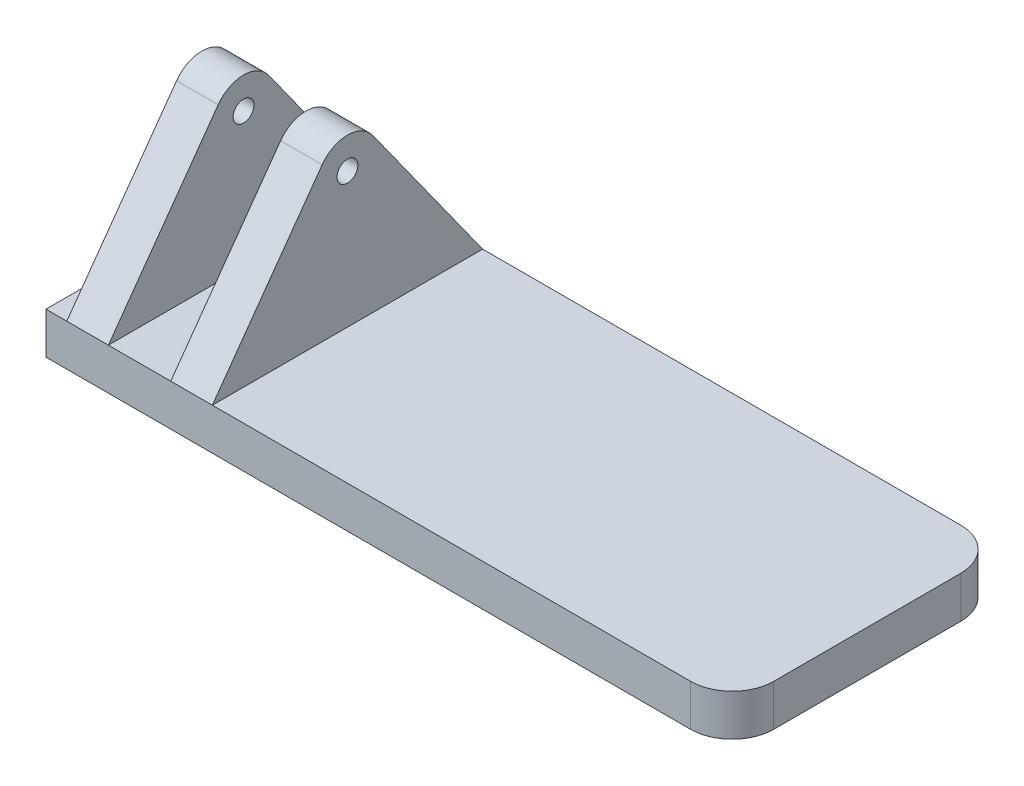
ISO-10303-21;
HEADER;
FILE_DESCRIPTION(('STEP AP214'),'2;1');
FILE_NAME('part.step','',(''),(''),'','','');
FILE_SCHEMA(('AUTOMOTIVE_DESIGN { 1 0 10303 214 1 1 1 1 }'));
ENDSEC;
DATA;
#1=APPLICATION_CONTEXT('core data for automotive mechanical design processes');
#2=APPLICATION_PROTOCOL_DEFINITION('international standard','automotive_design',2000,#1);
#3=PRODUCT_CONTEXT('',#1,'mechanical');
#4=PRODUCT('Part','Part','',(#3));
#5=PRODUCT_RELATED_PRODUCT_CATEGORY('part','',(#4));
#6=PRODUCT_DEFINITION_FORMATION('','',#4);
#7=PRODUCT_DEFINITION_CONTEXT('part definition',#1,'design');
#8=PRODUCT_DEFINITION('design','',#6,#7);
#9=PRODUCT_DEFINITION_SHAPE('','',#8);
#10=(LENGTH_UNIT() NAMED_UNIT(*) SI_UNIT(.MILLI.,.METRE.));
#11=(NAMED_UNIT(*) PLANE_ANGLE_UNIT() SI_UNIT($,.RADIAN.));
#12=(NAMED_UNIT(*) SI_UNIT($,.STERADIAN.) SOLID_ANGLE_UNIT());
#13=UNCERTAINTY_MEASURE_WITH_UNIT(LENGTH_MEASURE(1.E-05),#10,'distance_accuracy_value','');
#14=(GEOMETRIC_REPRESENTATION_CONTEXT(3) GLOBAL_UNCERTAINTY_ASSIGNED_CONTEXT((#13)) GLOBAL_UNIT_ASSIGNED_CONTEXT((#10,
#11,#12)) REPRESENTATION_CONTEXT('',''));
#15=CARTESIAN_POINT('',(0.,0.,0.));
#16=DIRECTION('',(0.,0.,1.));
#17=DIRECTION('',(1.,0.,0.));
#18=AXIS2_PLACEMENT_3D('',#15,#16,#17);
#19=CARTESIAN_POINT('',(49.2125,15.875,-3.175));
#20=DIRECTION('',(0.,-1.,0.));
#21=DIRECTION('',(0.,0.,-1.));
#22=AXIS2_PLACEMENT_3D('',#19,#20,#21);
#23=CYLINDRICAL_SURFACE('',#22,3.175);
#24=CARTESIAN_POINT('',(49.2125,3.175,-3.175));
#25=DIRECTION('',(0.,1.,0.));
#26=DIRECTION('',(-1.,0.,0.));
#27=AXIS2_PLACEMENT_3D('',#24,#25,#26);
#28=CIRCLE('',#27,3.175);
#29=CARTESIAN_POINT('',(49.2125,3.175,0.));
#30=VERTEX_POINT('',#29);
#31=CARTESIAN_POINT('',(52.3875,3.175,-3.175));
#32=VERTEX_POINT('',#31);
#33=EDGE_CURVE('E173',#30,#32,#28,.T.);
#34=ORIENTED_EDGE('',*,*,#33,.F.);
#35=DIRECTION('',(0.,-1.,0.));
#36=VECTOR('',#35,1.);
#37=CARTESIAN_POINT('',(49.2125,15.875,0.));
#38=LINE('',#37,#36);
#39=CARTESIAN_POINT('',(49.2125,0.,0.));
#40=VERTEX_POINT('',#39);
#41=EDGE_CURVE('E183',#30,#40,#38,.T.);
#42=ORIENTED_EDGE('',*,*,#41,.T.);
#43=CARTESIAN_POINT('',(49.2125,0.,-3.175));
#44=DIRECTION('',(0.,1.,0.));
#45=DIRECTION('',(0.,0.,-1.));
#46=AXIS2_PLACEMENT_3D('',#43,#44,#45);
#47=CIRCLE('',#46,3.175);
#48=CARTESIAN_POINT('',(52.3875,0.,-3.175));
#49=VERTEX_POINT('',#48);
#50=EDGE_CURVE('E169',#40,#49,#47,.T.);
#51=ORIENTED_EDGE('',*,*,#50,.T.);
#52=DIRECTION('',(0.,-1.,0.));
#53=VECTOR('',#52,1.);
#54=CARTESIAN_POINT('',(52.3875,15.875,-3.175));
#55=LINE('',#54,#53);
#56=EDGE_CURVE('E178',#32,#49,#55,.T.);
#57=ORIENTED_EDGE('',*,*,#56,.F.);
#58=EDGE_LOOP('',(#34,#42,#51,#57));
#59=FACE_BOUND('',#58,.T.);
#60=ADVANCED_FACE('F32',(#59),#23,.T.);
#61=CARTESIAN_POINT('',(49.2125,15.875,-17.4625));
#62=DIRECTION('',(0.,-1.,0.));
#63=DIRECTION('',(0.,0.,-1.));
#64=AXIS2_PLACEMENT_3D('',#61,#62,#63);
#65=CYLINDRICAL_SURFACE('',#64,3.175);
#66=CARTESIAN_POINT('',(49.2125,3.175,-17.4625));
#67=DIRECTION('',(0.,1.,0.));
#68=DIRECTION('',(-1.,0.,0.));
#69=AXIS2_PLACEMENT_3D('',#66,#67,#68);
#70=CIRCLE('',#69,3.175);
#71=CARTESIAN_POINT('',(52.3875,3.175,-17.4625));
#72=VERTEX_POINT('',#71);
#73=CARTESIAN_POINT('',(49.2125,3.175,-20.6375));
#74=VERTEX_POINT('',#73);
#75=EDGE_CURVE('E177',#72,#74,#70,.T.);
#76=ORIENTED_EDGE('',*,*,#75,.F.);
#77=DIRECTION('',(0.,-1.,0.));
#78=VECTOR('',#77,1.);
#79=CARTESIAN_POINT('',(52.3875,15.875,-17.4625));
#80=LINE('',#79,#78);
#81=CARTESIAN_POINT('',(52.3875,0.,-17.4625));
#82=VERTEX_POINT('',#81);
#83=EDGE_CURVE('E186',#72,#82,#80,.T.);
#84=ORIENTED_EDGE('',*,*,#83,.T.);
#85=CARTESIAN_POINT('',(49.2125,0.,-17.4625));
#86=DIRECTION('',(0.,1.,0.));
#87=DIRECTION('',(0.,0.,-1.));
#88=AXIS2_PLACEMENT_3D('',#85,#86,#87);
#89=CIRCLE('',#88,3.175);
#90=CARTESIAN_POINT('',(49.2125,0.,-20.6375));
#91=VERTEX_POINT('',#90);
#92=EDGE_CURVE('E172',#82,#91,#89,.T.);
#93=ORIENTED_EDGE('',*,*,#92,.T.);
#94=DIRECTION('',(0.,-1.,0.));
#95=VECTOR('',#94,1.);
#96=CARTESIAN_POINT('',(49.2125,15.875,-20.6375));
#97=LINE('',#96,#95);
#98=EDGE_CURVE('E181',#74,#91,#97,.T.);
#99=ORIENTED_EDGE('',*,*,#98,.F.);
#100=EDGE_LOOP('',(#76,#84,#93,#99));
#101=FACE_BOUND('',#100,.T.);
#102=ADVANCED_FACE('F304',(#101),#65,.T.);
#103=CARTESIAN_POINT('',(4.7625,3.175,-20.6375));
#104=DIRECTION('',(0.,1.,0.));
#105=DIRECTION('',(0.,0.,1.));
#106=AXIS2_PLACEMENT_3D('',#103,#104,#105);
#107=PLANE('',#106);
#108=DIRECTION('',(-1.,0.,0.));
#109=VECTOR('',#108,1.);
#110=CARTESIAN_POINT('',(4.7625,3.175,0.));
#111=LINE('',#110,#109);
#112=CARTESIAN_POINT('',(9.52500000000001,3.175,0.));
#113=VERTEX_POINT('',#112);
#114=CARTESIAN_POINT('',(4.7625,3.175,0.));
#115=VERTEX_POINT('',#114);
#116=EDGE_CURVE('E129',#113,#115,#111,.T.);
#117=ORIENTED_EDGE('',*,*,#116,.F.);
#118=DIRECTION('',(0.,0.,1.));
#119=VECTOR('',#118,1.);
#120=CARTESIAN_POINT('',(9.525,3.175,-20.6375));
#121=LINE('',#120,#119);
#122=CARTESIAN_POINT('',(9.525,3.175,-20.6375));
#123=VERTEX_POINT('',#122);
#124=EDGE_CURVE('E36',#123,#113,#121,.T.);
#125=ORIENTED_EDGE('',*,*,#124,.F.);
#126=DIRECTION('',(-1.,0.,0.));
#127=VECTOR('',#126,1.);
#128=CARTESIAN_POINT('',(4.7625,3.175,-20.6375));
#129=LINE('',#128,#127);
#130=CARTESIAN_POINT('',(4.7625,3.175,-20.6375));
#131=VERTEX_POINT('',#130);
#132=EDGE_CURVE('E132',#123,#131,#129,.T.);
#133=ORIENTED_EDGE('',*,*,#132,.T.);
#134=DIRECTION('',(0.,0.,1.));
#135=VECTOR('',#134,1.);
#136=CARTESIAN_POINT('',(4.7625,3.175,-20.6375));
#137=LINE('',#136,#135);
#138=EDGE_CURVE('E114',#131,#115,#137,.T.);
#139=ORIENTED_EDGE('',*,*,#138,.T.);
#140=EDGE_LOOP('',(#117,#125,#133,#139));
#141=FACE_BOUND('',#140,.T.);
#142=ADVANCED_FACE('F266',(#141),#107,.T.);
#143=CARTESIAN_POINT('',(52.3875,13.49375,-10.31875));
#144=DIRECTION('',(-1.,0.,0.));
#145=DIRECTION('',(0.,0.,1.));
#146=AXIS2_PLACEMENT_3D('',#143,#144,#145);
#147=CYLINDRICAL_SURFACE('',#146,2.38125);
#148=DIRECTION('',(-1.,0.,0.));
#149=VECTOR('',#148,1.);
#150=CARTESIAN_POINT('',(52.3875,14.8802197291081,-12.2547389598773));
#151=LINE('',#150,#149);
#152=CARTESIAN_POINT('',(12.7,14.8802197291081,-12.2547389598773));
#153=VERTEX_POINT('',#152);
#154=CARTESIAN_POINT('',(9.525,14.8802197291081,-12.2547389598773));
#155=VERTEX_POINT('',#154);
#156=EDGE_CURVE('E117',#153,#155,#151,.T.);
#157=ORIENTED_EDGE('',*,*,#156,.T.);
#158=CARTESIAN_POINT('',(9.525,13.49375,-10.31875));
#159=DIRECTION('',(-1.,0.,0.));
#160=DIRECTION('',(0.,0.,1.));
#161=AXIS2_PLACEMENT_3D('',#158,#159,#160);
#162=CIRCLE('',#161,2.38125);
#163=CARTESIAN_POINT('',(9.525,14.8802197291081,-8.38276104012266));
#164=VERTEX_POINT('',#163);
#165=EDGE_CURVE('E51',#155,#164,#162,.F.);
#166=ORIENTED_EDGE('',*,*,#165,.T.);
#167=DIRECTION('',(-1.,0.,0.));
#168=VECTOR('',#167,1.);
#169=CARTESIAN_POINT('',(52.3875,14.8802197291081,-8.38276104012266));
#170=LINE('',#169,#168);
#171=CARTESIAN_POINT('',(12.7,14.8802197291081,-8.38276104012266));
#172=VERTEX_POINT('',#171);
#173=EDGE_CURVE('E42',#172,#164,#170,.T.);
#174=ORIENTED_EDGE('',*,*,#173,.F.);
#175=CARTESIAN_POINT('',(12.7,13.49375,-10.31875));
#176=DIRECTION('',(1.,0.,0.));
#177=DIRECTION('',(0.,1.,0.));
#178=AXIS2_PLACEMENT_3D('',#175,#176,#177);
#179=CIRCLE('',#178,2.38125);
#180=EDGE_CURVE('E209',#172,#153,#179,.F.);
#181=ORIENTED_EDGE('',*,*,#180,.T.);
#182=EDGE_LOOP('',(#157,#166,#174,#181));
#183=FACE_BOUND('',#182,.T.);
#184=ADVANCED_FACE('F331',(#183),#147,.T.);
#185=CARTESIAN_POINT('',(52.3875,14.8802197291081,-12.2547389598773));
#186=DIRECTION('',(0.,-0.582244505662195,0.813013736431425));
#187=DIRECTION('',(0.,-0.813013736431425,-0.582244505662195));
#188=AXIS2_PLACEMENT_3D('',#185,#186,#187);
#189=PLANE('',#188);
#190=DIRECTION('',(-1.,0.,0.));
#191=VECTOR('',#190,1.);
#192=CARTESIAN_POINT('',(52.3875,3.175,-20.6375));
#193=LINE('',#192,#191);
#194=CARTESIAN_POINT('',(12.7,3.175,-20.6375));
#195=VERTEX_POINT('',#194);
#196=EDGE_CURVE('E203',#195,#123,#193,.T.);
#197=ORIENTED_EDGE('',*,*,#196,.T.);
#198=DIRECTION('',(0.,0.813013736431425,0.582244505662195));
#199=VECTOR('',#198,1.);
#200=CARTESIAN_POINT('',(9.525,3.175,-20.6375));
#201=LINE('',#200,#199);
#202=EDGE_CURVE('E128',#123,#155,#201,.T.);
#203=ORIENTED_EDGE('',*,*,#202,.T.);
#204=ORIENTED_EDGE('',*,*,#156,.F.);
#205=DIRECTION('',(0.,-0.813013736431425,-0.582244505662195));
#206=VECTOR('',#205,1.);
#207=CARTESIAN_POINT('',(12.7,11.5695899624526,-14.6256656804734));
#208=LINE('',#207,#206);
#209=EDGE_CURVE('E124',#153,#195,#208,.T.);
#210=ORIENTED_EDGE('',*,*,#209,.T.);
#211=EDGE_LOOP('',(#197,#203,#204,#210));
#212=FACE_BOUND('',#211,.T.);
#213=ADVANCED_FACE('F272',(#212),#189,.F.);
#214=CARTESIAN_POINT('',(9.525,3.175,-20.6375));
#215=DIRECTION('',(-1.,0.,0.));
#216=DIRECTION('',(0.,0.,1.));
#217=AXIS2_PLACEMENT_3D('',#214,#215,#216);
#218=PLANE('',#217);
#219=ORIENTED_EDGE('',*,*,#202,.F.);
#220=ORIENTED_EDGE('',*,*,#124,.T.);
#221=DIRECTION('',(0.,-0.813013736431425,0.582244505662194));
#222=VECTOR('',#221,1.);
#223=CARTESIAN_POINT('',(9.525,12.9442307692308,-6.99629131101456));
#224=LINE('',#223,#222);
#225=EDGE_CURVE('E123',#164,#113,#224,.T.);
#226=ORIENTED_EDGE('',*,*,#225,.F.);
#227=ORIENTED_EDGE('',*,*,#165,.F.);
#228=EDGE_LOOP('',(#219,#220,#226,#227));
#229=FACE_BOUND('',#228,.T.);
#230=CARTESIAN_POINT('',(9.525,13.49375,-10.31875));
#231=DIRECTION('',(-1.,0.,0.));
#232=DIRECTION('',(0.,0.,1.));
#233=AXIS2_PLACEMENT_3D('',#230,#231,#232);
#234=CIRCLE('',#233,0.793750000000002);
#235=CARTESIAN_POINT('',(9.525,13.49375,-9.525));
#236=VERTEX_POINT('',#235);
#237=EDGE_CURVE('E120',#236,#236,#234,.F.);
#238=ORIENTED_EDGE('',*,*,#237,.T.);
#239=EDGE_LOOP('',(#238));
#240=FACE_BOUND('',#239,.T.);
#241=ADVANCED_FACE('F268',(#229,#240),#218,.T.);
#242=CARTESIAN_POINT('',(52.3875,3.175,0.));
#243=DIRECTION('',(0.,-0.582244505662194,-0.813013736431425));
#244=DIRECTION('',(0.,0.813013736431425,-0.582244505662194));
#245=AXIS2_PLACEMENT_3D('',#242,#243,#244);
#246=PLANE('',#245);
#247=ORIENTED_EDGE('',*,*,#173,.T.);
#248=ORIENTED_EDGE('',*,*,#225,.T.);
#249=DIRECTION('',(-1.,0.,0.));
#250=VECTOR('',#249,1.);
#251=CARTESIAN_POINT('',(52.3875,3.175,0.));
#252=LINE('',#251,#250);
#253=CARTESIAN_POINT('',(12.7,3.175,0.));
#254=VERTEX_POINT('',#253);
#255=EDGE_CURVE('E131',#254,#113,#252,.T.);
#256=ORIENTED_EDGE('',*,*,#255,.F.);
#257=DIRECTION('',(0.,0.813013736431425,-0.582244505662194));
#258=VECTOR('',#257,1.);
#259=CARTESIAN_POINT('',(12.7,21.3388207316833,-13.0081256305412));
#260=LINE('',#259,#258);
#261=EDGE_CURVE('E168',#254,#172,#260,.T.);
#262=ORIENTED_EDGE('',*,*,#261,.T.);
#263=EDGE_LOOP('',(#247,#248,#256,#262));
#264=FACE_BOUND('',#263,.T.);
#265=ADVANCED_FACE('F267',(#264),#246,.F.);
#266=CARTESIAN_POINT('',(12.7,3.175,-20.6375));
#267=DIRECTION('',(0.,1.,0.));
#268=DIRECTION('',(-1.,0.,0.));
#269=AXIS2_PLACEMENT_3D('',#266,#267,#268);
#270=PLANE('',#269);
#271=DIRECTION('',(-1.,0.,0.));
#272=VECTOR('',#271,1.);
#273=CARTESIAN_POINT('',(12.7,3.175,0.));
#274=LINE('',#273,#272);
#275=EDGE_CURVE('E176',#30,#254,#274,.T.);
#276=ORIENTED_EDGE('',*,*,#275,.F.);
#277=ORIENTED_EDGE('',*,*,#33,.T.);
#278=DIRECTION('',(0.,0.,1.));
#279=VECTOR('',#278,1.);
#280=CARTESIAN_POINT('',(52.3875,3.175,-20.6375));
#281=LINE('',#280,#279);
#282=EDGE_CURVE('E182',#72,#32,#281,.T.);
#283=ORIENTED_EDGE('',*,*,#282,.F.);
#284=ORIENTED_EDGE('',*,*,#75,.T.);
#285=DIRECTION('',(-1.,0.,0.));
#286=VECTOR('',#285,1.);
#287=CARTESIAN_POINT('',(12.7,3.175,-20.6375));
#288=LINE('',#287,#286);
#289=EDGE_CURVE('E196',#74,#195,#288,.T.);
#290=ORIENTED_EDGE('',*,*,#289,.T.);
#291=DIRECTION('',(0.,0.,1.));
#292=VECTOR('',#291,1.);
#293=CARTESIAN_POINT('',(12.7,3.175,-20.6375));
#294=LINE('',#293,#292);
#295=EDGE_CURVE('E119',#195,#254,#294,.T.);
#296=ORIENTED_EDGE('',*,*,#295,.T.);
#297=EDGE_LOOP('',(#276,#277,#283,#284,#290,#296));
#298=FACE_BOUND('',#297,.T.);
#299=ADVANCED_FACE('F311',(#298),#270,.T.);
#300=CARTESIAN_POINT('',(12.7,15.875,-20.6375));
#301=DIRECTION('',(1.,0.,0.));
#302=DIRECTION('',(0.,1.,0.));
#303=AXIS2_PLACEMENT_3D('',#300,#301,#302);
#304=PLANE('',#303);
#305=ORIENTED_EDGE('',*,*,#209,.F.);
#306=ORIENTED_EDGE('',*,*,#180,.F.);
#307=ORIENTED_EDGE('',*,*,#261,.F.);
#308=ORIENTED_EDGE('',*,*,#295,.F.);
#309=EDGE_LOOP('',(#305,#306,#307,#308));
#310=FACE_BOUND('',#309,.T.);
#311=CARTESIAN_POINT('',(12.7,13.49375,-10.31875));
#312=DIRECTION('',(1.,0.,0.));
#313=DIRECTION('',(0.,1.,0.));
#314=AXIS2_PLACEMENT_3D('',#311,#312,#313);
#315=CIRCLE('',#314,0.793750000000002);
#316=CARTESIAN_POINT('',(12.7,14.2875,-10.31875));
#317=VERTEX_POINT('',#316);
#318=EDGE_CURVE('E165',#317,#317,#315,.F.);
#319=ORIENTED_EDGE('',*,*,#318,.T.);
#320=EDGE_LOOP('',(#319));
#321=FACE_BOUND('',#320,.T.);
#322=ADVANCED_FACE('F347',(#310,#321),#304,.T.);
#323=CARTESIAN_POINT('',(4.7625,14.8802197291081,-12.2547389598773));
#324=VERTEX_POINT('',#323);
#325=CARTESIAN_POINT('',(1.5875,14.8802197291081,-12.2547389598773));
#326=VERTEX_POINT('',#325);
#327=EDGE_CURVE('E88',#324,#326,#151,.T.);
#328=ORIENTED_EDGE('',*,*,#327,.T.);
#329=CARTESIAN_POINT('',(1.5875,13.49375,-10.31875));
#330=DIRECTION('',(-1.,0.,0.));
#331=DIRECTION('',(0.,0.,1.));
#332=AXIS2_PLACEMENT_3D('',#329,#330,#331);
#333=CIRCLE('',#332,2.38125);
#334=CARTESIAN_POINT('',(1.5875,14.8802197291081,-8.38276104012266));
#335=VERTEX_POINT('',#334);
#336=EDGE_CURVE('E83',#326,#335,#333,.F.);
#337=ORIENTED_EDGE('',*,*,#336,.T.);
#338=CARTESIAN_POINT('',(4.7625,14.8802197291081,-8.38276104012266));
#339=VERTEX_POINT('',#338);
#340=EDGE_CURVE('E11',#339,#335,#170,.T.);
#341=ORIENTED_EDGE('',*,*,#340,.F.);
#342=CARTESIAN_POINT('',(4.7625,13.49375,-10.31875));
#343=DIRECTION('',(1.,0.,0.));
#344=DIRECTION('',(0.,1.,0.));
#345=AXIS2_PLACEMENT_3D('',#342,#343,#344);
#346=CIRCLE('',#345,2.38125);
#347=EDGE_CURVE('E139',#339,#324,#346,.F.);
#348=ORIENTED_EDGE('',*,*,#347,.T.);
#349=EDGE_LOOP('',(#328,#337,#341,#348));
#350=FACE_BOUND('',#349,.T.);
#351=ADVANCED_FACE('F84',(#350),#147,.T.);
#352=CARTESIAN_POINT('',(1.5875,3.175,-20.6375));
#353=VERTEX_POINT('',#352);
#354=EDGE_CURVE('E135',#131,#353,#193,.T.);
#355=ORIENTED_EDGE('',*,*,#354,.T.);
#356=DIRECTION('',(0.,0.813013736431425,0.582244505662195));
#357=VECTOR('',#356,1.);
#358=CARTESIAN_POINT('',(1.5875,3.175,-20.6375));
#359=LINE('',#358,#357);
#360=EDGE_CURVE('E93',#353,#326,#359,.T.);
#361=ORIENTED_EDGE('',*,*,#360,.T.);
#362=ORIENTED_EDGE('',*,*,#327,.F.);
#363=DIRECTION('',(0.,-0.813013736431425,-0.582244505662195));
#364=VECTOR('',#363,1.);
#365=CARTESIAN_POINT('',(4.7625,11.5695899624526,-14.6256656804734));
#366=LINE('',#365,#364);
#367=EDGE_CURVE('E110',#324,#131,#366,.T.);
#368=ORIENTED_EDGE('',*,*,#367,.T.);
#369=EDGE_LOOP('',(#355,#361,#362,#368));
#370=FACE_BOUND('',#369,.T.);
#371=ADVANCED_FACE('F225',(#370),#189,.F.);
#372=CARTESIAN_POINT('',(0.,3.175,-20.6375));
#373=DIRECTION('',(0.,1.,0.));
#374=DIRECTION('',(0.,0.,1.));
#375=AXIS2_PLACEMENT_3D('',#372,#373,#374);
#376=PLANE('',#375);
#377=DIRECTION('',(-1.,0.,0.));
#378=VECTOR('',#377,1.);
#379=CARTESIAN_POINT('',(0.,3.175,0.));
#380=LINE('',#379,#378);
#381=CARTESIAN_POINT('',(1.5875,3.175,0.));
#382=VERTEX_POINT('',#381);
#383=CARTESIAN_POINT('',(0.,3.175,0.));
#384=VERTEX_POINT('',#383);
#385=EDGE_CURVE('E191',#382,#384,#380,.T.);
#386=ORIENTED_EDGE('',*,*,#385,.F.);
#387=DIRECTION('',(0.,0.,1.));
#388=VECTOR('',#387,1.);
#389=CARTESIAN_POINT('',(1.5875,3.175,-20.6375));
#390=LINE('',#389,#388);
#391=EDGE_CURVE('E106',#353,#382,#390,.T.);
#392=ORIENTED_EDGE('',*,*,#391,.F.);
#393=DIRECTION('',(-1.,0.,0.));
#394=VECTOR('',#393,1.);
#395=CARTESIAN_POINT('',(0.,3.175,-20.6375));
#396=LINE('',#395,#394);
#397=CARTESIAN_POINT('',(0.,3.175,-20.6375));
#398=VERTEX_POINT('',#397);
#399=EDGE_CURVE('E217',#353,#398,#396,.T.);
#400=ORIENTED_EDGE('',*,*,#399,.T.);
#401=DIRECTION('',(0.,0.,1.));
#402=VECTOR('',#401,1.);
#403=CARTESIAN_POINT('',(0.,3.175,-20.6375));
#404=LINE('',#403,#402);
#405=EDGE_CURVE('E136',#398,#384,#404,.T.);
#406=ORIENTED_EDGE('',*,*,#405,.T.);
#407=EDGE_LOOP('',(#386,#392,#400,#406));
#408=FACE_BOUND('',#407,.T.);
#409=ADVANCED_FACE('F234',(#408),#376,.T.);
#410=CARTESIAN_POINT('',(1.5875,3.175,-20.6375));
#411=DIRECTION('',(-1.,0.,0.));
#412=DIRECTION('',(0.,0.,1.));
#413=AXIS2_PLACEMENT_3D('',#410,#411,#412);
#414=PLANE('',#413);
#415=ORIENTED_EDGE('',*,*,#360,.F.);
#416=ORIENTED_EDGE('',*,*,#391,.T.);
#417=DIRECTION('',(0.,-0.813013736431425,0.582244505662194));
#418=VECTOR('',#417,1.);
#419=CARTESIAN_POINT('',(1.5875,12.9442307692308,-6.99629131101456));
#420=LINE('',#419,#418);
#421=EDGE_CURVE('E94',#335,#382,#420,.T.);
#422=ORIENTED_EDGE('',*,*,#421,.F.);
#423=ORIENTED_EDGE('',*,*,#336,.F.);
#424=EDGE_LOOP('',(#415,#416,#422,#423));
#425=FACE_BOUND('',#424,.T.);
#426=CARTESIAN_POINT('',(1.5875,13.49375,-10.31875));
#427=DIRECTION('',(-1.,0.,0.));
#428=DIRECTION('',(0.,0.,1.));
#429=AXIS2_PLACEMENT_3D('',#426,#427,#428);
#430=CIRCLE('',#429,0.793750000000002);
#431=CARTESIAN_POINT('',(1.5875,13.49375,-9.525));
#432=VERTEX_POINT('',#431);
#433=EDGE_CURVE('E107',#432,#432,#430,.F.);
#434=ORIENTED_EDGE('',*,*,#433,.T.);
#435=EDGE_LOOP('',(#434));
#436=FACE_BOUND('',#435,.T.);
#437=ADVANCED_FACE('F103',(#425,#436),#414,.T.);
#438=ORIENTED_EDGE('',*,*,#340,.T.);
#439=ORIENTED_EDGE('',*,*,#421,.T.);
#440=EDGE_CURVE('E72',#115,#382,#252,.T.);
#441=ORIENTED_EDGE('',*,*,#440,.F.);
#442=DIRECTION('',(0.,0.813013736431425,-0.582244505662194));
#443=VECTOR('',#442,1.);
#444=CARTESIAN_POINT('',(4.7625,21.3388207316833,-13.0081256305412));
#445=LINE('',#444,#443);
#446=EDGE_CURVE('E102',#115,#339,#445,.T.);
#447=ORIENTED_EDGE('',*,*,#446,.T.);
#448=EDGE_LOOP('',(#438,#439,#441,#447));
#449=FACE_BOUND('',#448,.T.);
#450=ADVANCED_FACE('F99',(#449),#246,.F.);
#451=CARTESIAN_POINT('',(4.7625,15.875,-20.6375));
#452=DIRECTION('',(1.,0.,0.));
#453=DIRECTION('',(0.,1.,0.));
#454=AXIS2_PLACEMENT_3D('',#451,#452,#453);
#455=PLANE('',#454);
#456=ORIENTED_EDGE('',*,*,#367,.F.);
#457=ORIENTED_EDGE('',*,*,#347,.F.);
#458=ORIENTED_EDGE('',*,*,#446,.F.);
#459=ORIENTED_EDGE('',*,*,#138,.F.);
#460=EDGE_LOOP('',(#456,#457,#458,#459));
#461=FACE_BOUND('',#460,.T.);
#462=CARTESIAN_POINT('',(4.7625,13.49375,-10.31875));
#463=DIRECTION('',(1.,0.,0.));
#464=DIRECTION('',(0.,1.,0.));
#465=AXIS2_PLACEMENT_3D('',#462,#463,#464);
#466=CIRCLE('',#465,0.793750000000002);
#467=CARTESIAN_POINT('',(4.7625,14.2875,-10.31875));
#468=VERTEX_POINT('',#467);
#469=EDGE_CURVE('E125',#468,#468,#466,.F.);
#470=ORIENTED_EDGE('',*,*,#469,.T.);
#471=EDGE_LOOP('',(#470));
#472=FACE_BOUND('',#471,.T.);
#473=ADVANCED_FACE('F283',(#461,#472),#455,.T.);
#474=CARTESIAN_POINT('',(52.3875,13.49375,-10.31875));
#475=DIRECTION('',(-1.,0.,0.));
#476=DIRECTION('',(0.,0.,1.));
#477=AXIS2_PLACEMENT_3D('',#474,#475,#476);
#478=CYLINDRICAL_SURFACE('',#477,0.793750000000002);
#479=ORIENTED_EDGE('',*,*,#433,.F.);
#480=EDGE_LOOP('',(#479));
#481=FACE_BOUND('',#480,.T.);
#482=ORIENTED_EDGE('',*,*,#469,.F.);
#483=EDGE_LOOP('',(#482));
#484=FACE_BOUND('',#483,.T.);
#485=ADVANCED_FACE('F359',(#481,#484),#478,.F.);
#486=ORIENTED_EDGE('',*,*,#237,.F.);
#487=EDGE_LOOP('',(#486));
#488=FACE_BOUND('',#487,.T.);
#489=ORIENTED_EDGE('',*,*,#318,.F.);
#490=EDGE_LOOP('',(#489));
#491=FACE_BOUND('',#490,.T.);
#492=ADVANCED_FACE('F353',(#488,#491),#478,.F.);
#493=CARTESIAN_POINT('',(49.2125,0.,-17.4625));
#494=DIRECTION('',(0.,-1.,0.));
#495=DIRECTION('',(0.,0.,-1.));
#496=AXIS2_PLACEMENT_3D('',#493,#494,#495);
#497=PLANE('',#496);
#498=DIRECTION('',(1.,0.,0.));
#499=VECTOR('',#498,1.);
#500=CARTESIAN_POINT('',(49.2125,0.,0.));
#501=LINE('',#500,#499);
#502=CARTESIAN_POINT('',(0.,0.,0.));
#503=VERTEX_POINT('',#502);
#504=EDGE_CURVE('E115',#503,#40,#501,.T.);
#505=ORIENTED_EDGE('',*,*,#504,.F.);
#506=DIRECTION('',(0.,0.,1.));
#507=VECTOR('',#506,1.);
#508=CARTESIAN_POINT('',(0.,0.,0.));
#509=LINE('',#508,#507);
#510=CARTESIAN_POINT('',(0.,0.,-20.6375));
#511=VERTEX_POINT('',#510);
#512=EDGE_CURVE('E206',#511,#503,#509,.T.);
#513=ORIENTED_EDGE('',*,*,#512,.F.);
#514=DIRECTION('',(-1.,0.,0.));
#515=VECTOR('',#514,1.);
#516=CARTESIAN_POINT('',(0.,0.,-20.6375));
#517=LINE('',#516,#515);
#518=EDGE_CURVE('E301',#91,#511,#517,.T.);
#519=ORIENTED_EDGE('',*,*,#518,.F.);
#520=ORIENTED_EDGE('',*,*,#92,.F.);
#521=DIRECTION('',(0.,0.,-1.));
#522=VECTOR('',#521,1.);
#523=CARTESIAN_POINT('',(52.3875,0.,-17.4625));
#524=LINE('',#523,#522);
#525=EDGE_CURVE('E296',#49,#82,#524,.T.);
#526=ORIENTED_EDGE('',*,*,#525,.F.);
#527=ORIENTED_EDGE('',*,*,#50,.F.);
#528=EDGE_LOOP('',(#505,#513,#519,#520,#526,#527));
#529=FACE_BOUND('',#528,.T.);
#530=ADVANCED_FACE('F307',(#529),#497,.T.);
#531=CARTESIAN_POINT('',(0.,15.875,0.));
#532=DIRECTION('',(1.,0.,0.));
#533=DIRECTION('',(0.,0.,-1.));
#534=AXIS2_PLACEMENT_3D('',#531,#532,#533);
#535=PLANE('',#534);
#536=ORIENTED_EDGE('',*,*,#405,.F.);
#537=DIRECTION('',(0.,-1.,0.));
#538=VECTOR('',#537,1.);
#539=CARTESIAN_POINT('',(0.,15.875,-20.6375));
#540=LINE('',#539,#538);
#541=EDGE_CURVE('E199',#398,#511,#540,.T.);
#542=ORIENTED_EDGE('',*,*,#541,.T.);
#543=ORIENTED_EDGE('',*,*,#512,.T.);
#544=DIRECTION('',(0.,-1.,0.));
#545=VECTOR('',#544,1.);
#546=CARTESIAN_POINT('',(0.,15.875,0.));
#547=LINE('',#546,#545);
#548=EDGE_CURVE('E63',#384,#503,#547,.T.);
#549=ORIENTED_EDGE('',*,*,#548,.F.);
#550=EDGE_LOOP('',(#536,#542,#543,#549));
#551=FACE_BOUND('',#550,.T.);
#552=ADVANCED_FACE('F365',(#551),#535,.F.);
#553=CARTESIAN_POINT('',(0.,15.875,-20.6375));
#554=DIRECTION('',(0.,0.,1.));
#555=DIRECTION('',(1.,0.,0.));
#556=AXIS2_PLACEMENT_3D('',#553,#554,#555);
#557=PLANE('',#556);
#558=ORIENTED_EDGE('',*,*,#289,.F.);
#559=ORIENTED_EDGE('',*,*,#98,.T.);
#560=ORIENTED_EDGE('',*,*,#518,.T.);
#561=ORIENTED_EDGE('',*,*,#541,.F.);
#562=ORIENTED_EDGE('',*,*,#399,.F.);
#563=ORIENTED_EDGE('',*,*,#354,.F.);
#564=ORIENTED_EDGE('',*,*,#132,.F.);
#565=ORIENTED_EDGE('',*,*,#196,.F.);
#566=EDGE_LOOP('',(#558,#559,#560,#561,#562,#563,#564,#565));
#567=FACE_BOUND('',#566,.T.);
#568=ADVANCED_FACE('F279',(#567),#557,.F.);
#569=CARTESIAN_POINT('',(49.2125,15.875,0.));
#570=DIRECTION('',(0.,0.,-1.));
#571=DIRECTION('',(-1.,0.,0.));
#572=AXIS2_PLACEMENT_3D('',#569,#570,#571);
#573=PLANE('',#572);
#574=ORIENTED_EDGE('',*,*,#41,.F.);
#575=ORIENTED_EDGE('',*,*,#275,.T.);
#576=ORIENTED_EDGE('',*,*,#255,.T.);
#577=ORIENTED_EDGE('',*,*,#116,.T.);
#578=ORIENTED_EDGE('',*,*,#440,.T.);
#579=ORIENTED_EDGE('',*,*,#385,.T.);
#580=ORIENTED_EDGE('',*,*,#548,.T.);
#581=ORIENTED_EDGE('',*,*,#504,.T.);
#582=EDGE_LOOP('',(#574,#575,#576,#577,#578,#579,#580,#581));
#583=FACE_BOUND('',#582,.T.);
#584=ADVANCED_FACE('F239',(#583),#573,.F.);
#585=CARTESIAN_POINT('',(52.3875,15.875,-17.4625));
#586=DIRECTION('',(-1.,0.,0.));
#587=DIRECTION('',(0.,0.,1.));
#588=AXIS2_PLACEMENT_3D('',#585,#586,#587);
#589=PLANE('',#588);
#590=ORIENTED_EDGE('',*,*,#83,.F.);
#591=ORIENTED_EDGE('',*,*,#282,.T.);
#592=ORIENTED_EDGE('',*,*,#56,.T.);
#593=ORIENTED_EDGE('',*,*,#525,.T.);
#594=EDGE_LOOP('',(#590,#591,#592,#593));
#595=FACE_BOUND('',#594,.T.);
#596=ADVANCED_FACE('F34',(#595),#589,.F.);
#597=CLOSED_SHELL('',(#60,#102,#142,#184,#213,#241,#265,#299,#322,#351,#371,#409,#437,#450,#473,
#485,#492,#530,#552,#568,#584,#596));
#598=MANIFOLD_SOLID_BREP('B2',#597);
#599=ADVANCED_BREP_SHAPE_REPRESENTATION('',(#18,#598),#14);
#600=SHAPE_DEFINITION_REPRESENTATION(#9,#599);
ENDSEC;
END-ISO-10303-21;
